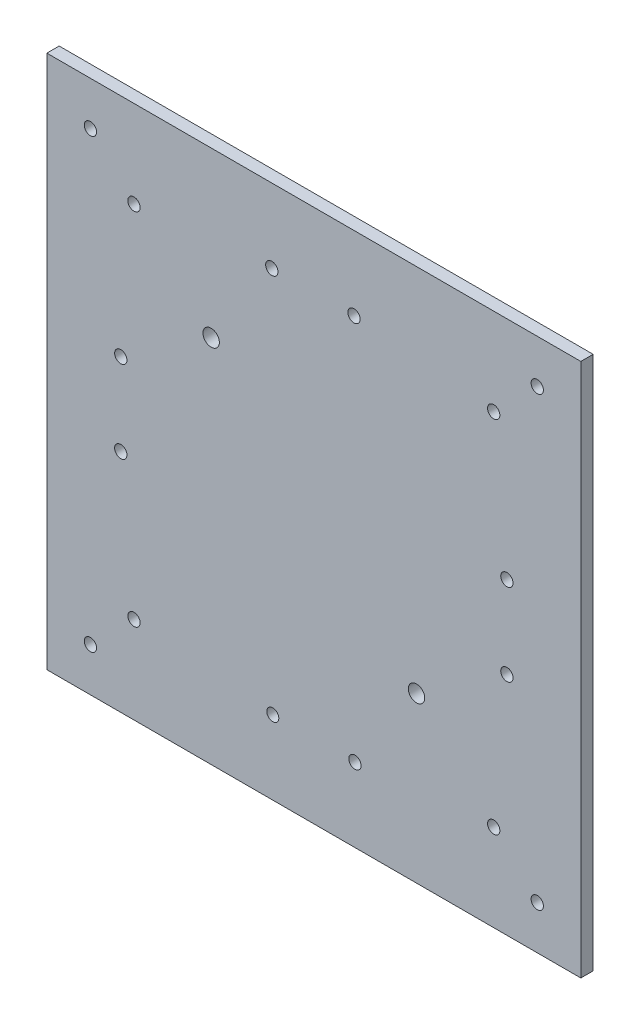
ISO-10303-21;
HEADER;
FILE_DESCRIPTION(('STEP AP214'),'2;1');
FILE_NAME('part.step','',(''),(''),'','','');
FILE_SCHEMA(('AUTOMOTIVE_DESIGN { 1 0 10303 214 1 1 1 1 }'));
ENDSEC;
DATA;
#1=APPLICATION_CONTEXT('core data for automotive mechanical design processes');
#2=APPLICATION_PROTOCOL_DEFINITION('international standard','automotive_design',2000,#1);
#3=PRODUCT_CONTEXT('',#1,'mechanical');
#4=PRODUCT('Part','Part','',(#3));
#5=PRODUCT_RELATED_PRODUCT_CATEGORY('part','',(#4));
#6=PRODUCT_DEFINITION_FORMATION('','',#4);
#7=PRODUCT_DEFINITION_CONTEXT('part definition',#1,'design');
#8=PRODUCT_DEFINITION('design','',#6,#7);
#9=PRODUCT_DEFINITION_SHAPE('','',#8);
#10=(LENGTH_UNIT() NAMED_UNIT(*) SI_UNIT(.MILLI.,.METRE.));
#11=(NAMED_UNIT(*) PLANE_ANGLE_UNIT() SI_UNIT($,.RADIAN.));
#12=(NAMED_UNIT(*) SI_UNIT($,.STERADIAN.) SOLID_ANGLE_UNIT());
#13=UNCERTAINTY_MEASURE_WITH_UNIT(LENGTH_MEASURE(1.E-05),#10,'distance_accuracy_value','');
#14=(GEOMETRIC_REPRESENTATION_CONTEXT(3) GLOBAL_UNCERTAINTY_ASSIGNED_CONTEXT((#13)) GLOBAL_UNIT_ASSIGNED_CONTEXT((#10,
#11,#12)) REPRESENTATION_CONTEXT('',''));
#15=CARTESIAN_POINT('',(0.,0.,0.));
#16=DIRECTION('',(0.,0.,1.));
#17=DIRECTION('',(1.,0.,0.));
#18=AXIS2_PLACEMENT_3D('',#15,#16,#17);
#19=CARTESIAN_POINT('',(-65.,-65.,3.));
#20=DIRECTION('',(1.,0.,0.));
#21=DIRECTION('',(0.,0.,-1.));
#22=AXIS2_PLACEMENT_3D('',#19,#20,#21);
#23=PLANE('',#22);
#24=DIRECTION('',(0.,-1.,0.));
#25=VECTOR('',#24,1.);
#26=CARTESIAN_POINT('',(-65.,-65.,0.));
#27=LINE('',#26,#25);
#28=CARTESIAN_POINT('',(-65.,65.,0.));
#29=VERTEX_POINT('',#28);
#30=CARTESIAN_POINT('',(-65.,-65.,0.));
#31=VERTEX_POINT('',#30);
#32=EDGE_CURVE('E106',#29,#31,#27,.T.);
#33=ORIENTED_EDGE('',*,*,#32,.T.);
#34=DIRECTION('',(0.,0.,-1.));
#35=VECTOR('',#34,1.);
#36=CARTESIAN_POINT('',(-65.,-65.,3.));
#37=LINE('',#36,#35);
#38=CARTESIAN_POINT('',(-65.,-65.,3.));
#39=VERTEX_POINT('',#38);
#40=EDGE_CURVE('E11',#39,#31,#37,.T.);
#41=ORIENTED_EDGE('',*,*,#40,.F.);
#42=DIRECTION('',(0.,-1.,0.));
#43=VECTOR('',#42,1.);
#44=CARTESIAN_POINT('',(-65.,-65.,3.));
#45=LINE('',#44,#43);
#46=CARTESIAN_POINT('',(-65.,65.,3.));
#47=VERTEX_POINT('',#46);
#48=EDGE_CURVE('E93',#47,#39,#45,.T.);
#49=ORIENTED_EDGE('',*,*,#48,.F.);
#50=DIRECTION('',(0.,0.,-1.));
#51=VECTOR('',#50,1.);
#52=CARTESIAN_POINT('',(-65.,65.,3.));
#53=LINE('',#52,#51);
#54=EDGE_CURVE('E102',#47,#29,#53,.T.);
#55=ORIENTED_EDGE('',*,*,#54,.T.);
#56=EDGE_LOOP('',(#33,#41,#49,#55));
#57=FACE_BOUND('',#56,.T.);
#58=ADVANCED_FACE('F40',(#57),#23,.F.);
#59=CARTESIAN_POINT('',(65.,-65.,3.));
#60=DIRECTION('',(0.,1.,0.));
#61=DIRECTION('',(-1.,0.,0.));
#62=AXIS2_PLACEMENT_3D('',#59,#60,#61);
#63=PLANE('',#62);
#64=DIRECTION('',(1.,0.,0.));
#65=VECTOR('',#64,1.);
#66=CARTESIAN_POINT('',(65.,-65.,0.));
#67=LINE('',#66,#65);
#68=CARTESIAN_POINT('',(65.,-65.,0.));
#69=VERTEX_POINT('',#68);
#70=EDGE_CURVE('E97',#31,#69,#67,.T.);
#71=ORIENTED_EDGE('',*,*,#70,.T.);
#72=DIRECTION('',(0.,0.,-1.));
#73=VECTOR('',#72,1.);
#74=CARTESIAN_POINT('',(65.,-65.,3.));
#75=LINE('',#74,#73);
#76=CARTESIAN_POINT('',(65.,-65.,3.));
#77=VERTEX_POINT('',#76);
#78=EDGE_CURVE('E49',#77,#69,#75,.T.);
#79=ORIENTED_EDGE('',*,*,#78,.F.);
#80=DIRECTION('',(1.,0.,0.));
#81=VECTOR('',#80,1.);
#82=CARTESIAN_POINT('',(65.,-65.,3.));
#83=LINE('',#82,#81);
#84=EDGE_CURVE('E88',#39,#77,#83,.T.);
#85=ORIENTED_EDGE('',*,*,#84,.F.);
#86=ORIENTED_EDGE('',*,*,#40,.T.);
#87=EDGE_LOOP('',(#71,#79,#85,#86));
#88=FACE_BOUND('',#87,.T.);
#89=ADVANCED_FACE('F96',(#88),#63,.F.);
#90=CARTESIAN_POINT('',(65.,-65.,3.));
#91=DIRECTION('',(-1.,0.,0.));
#92=DIRECTION('',(0.,0.,1.));
#93=AXIS2_PLACEMENT_3D('',#90,#91,#92);
#94=PLANE('',#93);
#95=DIRECTION('',(0.,1.,0.));
#96=VECTOR('',#95,1.);
#97=CARTESIAN_POINT('',(65.,-65.,0.));
#98=LINE('',#97,#96);
#99=CARTESIAN_POINT('',(65.,65.,0.));
#100=VERTEX_POINT('',#99);
#101=EDGE_CURVE('E75',#69,#100,#98,.T.);
#102=ORIENTED_EDGE('',*,*,#101,.T.);
#103=DIRECTION('',(0.,0.,-1.));
#104=VECTOR('',#103,1.);
#105=CARTESIAN_POINT('',(65.,65.,3.));
#106=LINE('',#105,#104);
#107=CARTESIAN_POINT('',(65.,65.,3.));
#108=VERTEX_POINT('',#107);
#109=EDGE_CURVE('E98',#108,#100,#106,.T.);
#110=ORIENTED_EDGE('',*,*,#109,.F.);
#111=DIRECTION('',(0.,1.,0.));
#112=VECTOR('',#111,1.);
#113=CARTESIAN_POINT('',(65.,-65.,3.));
#114=LINE('',#113,#112);
#115=EDGE_CURVE('E91',#77,#108,#114,.T.);
#116=ORIENTED_EDGE('',*,*,#115,.F.);
#117=ORIENTED_EDGE('',*,*,#78,.T.);
#118=EDGE_LOOP('',(#102,#110,#116,#117));
#119=FACE_BOUND('',#118,.T.);
#120=ADVANCED_FACE('F100',(#119),#94,.F.);
#121=CARTESIAN_POINT('',(65.,65.,3.));
#122=DIRECTION('',(0.,-1.,0.));
#123=DIRECTION('',(0.,0.,-1.));
#124=AXIS2_PLACEMENT_3D('',#121,#122,#123);
#125=PLANE('',#124);
#126=DIRECTION('',(-1.,0.,0.));
#127=VECTOR('',#126,1.);
#128=CARTESIAN_POINT('',(65.,65.,0.));
#129=LINE('',#128,#127);
#130=EDGE_CURVE('E81',#100,#29,#129,.T.);
#131=ORIENTED_EDGE('',*,*,#130,.T.);
#132=ORIENTED_EDGE('',*,*,#54,.F.);
#133=DIRECTION('',(-1.,0.,0.));
#134=VECTOR('',#133,1.);
#135=CARTESIAN_POINT('',(65.,65.,3.));
#136=LINE('',#135,#134);
#137=EDGE_CURVE('E58',#108,#47,#136,.T.);
#138=ORIENTED_EDGE('',*,*,#137,.F.);
#139=ORIENTED_EDGE('',*,*,#109,.T.);
#140=EDGE_LOOP('',(#131,#132,#138,#139));
#141=FACE_BOUND('',#140,.T.);
#142=ADVANCED_FACE('F232',(#141),#125,.F.);
#143=CARTESIAN_POINT('',(0.,0.,3.));
#144=DIRECTION('',(0.,0.,1.));
#145=DIRECTION('',(1.,0.,0.));
#146=AXIS2_PLACEMENT_3D('',#143,#144,#145);
#147=PLANE('',#146);
#148=CARTESIAN_POINT('',(47.,-10.,3.));
#149=DIRECTION('',(0.,0.,1.));
#150=DIRECTION('',(1.,0.,0.));
#151=AXIS2_PLACEMENT_3D('',#148,#149,#150);
#152=CIRCLE('',#151,1.5);
#153=CARTESIAN_POINT('',(48.5,-10.,3.));
#154=VERTEX_POINT('',#153);
#155=EDGE_CURVE('E193',#154,#154,#152,.T.);
#156=ORIENTED_EDGE('',*,*,#155,.F.);
#157=EDGE_LOOP('',(#156));
#158=FACE_BOUND('',#157,.T.);
#159=CARTESIAN_POINT('',(-47.,-10.,3.));
#160=DIRECTION('',(0.,0.,1.));
#161=DIRECTION('',(1.,0.,0.));
#162=AXIS2_PLACEMENT_3D('',#159,#160,#161);
#163=CIRCLE('',#162,1.5);
#164=CARTESIAN_POINT('',(-45.5,-10.,3.));
#165=VERTEX_POINT('',#164);
#166=EDGE_CURVE('E196',#165,#165,#163,.T.);
#167=ORIENTED_EDGE('',*,*,#166,.F.);
#168=EDGE_LOOP('',(#167));
#169=FACE_BOUND('',#168,.T.);
#170=CARTESIAN_POINT('',(-47.,10.,3.));
#171=DIRECTION('',(0.,0.,1.));
#172=DIRECTION('',(1.,0.,0.));
#173=AXIS2_PLACEMENT_3D('',#170,#171,#172);
#174=CIRCLE('',#173,1.49999999999999);
#175=CARTESIAN_POINT('',(-45.5,10.,3.));
#176=VERTEX_POINT('',#175);
#177=EDGE_CURVE('E200',#176,#176,#174,.T.);
#178=ORIENTED_EDGE('',*,*,#177,.F.);
#179=EDGE_LOOP('',(#178));
#180=FACE_BOUND('',#179,.T.);
#181=CARTESIAN_POINT('',(54.3933982822018,54.3933982822018,3.));
#182=DIRECTION('',(0.,0.,1.));
#183=DIRECTION('',(1.,0.,0.));
#184=AXIS2_PLACEMENT_3D('',#181,#182,#183);
#185=CIRCLE('',#184,1.5);
#186=CARTESIAN_POINT('',(55.8933982822018,54.3933982822018,3.));
#187=VERTEX_POINT('',#186);
#188=EDGE_CURVE('E185',#187,#187,#185,.T.);
#189=ORIENTED_EDGE('',*,*,#188,.F.);
#190=EDGE_LOOP('',(#189));
#191=FACE_BOUND('',#190,.T.);
#192=CARTESIAN_POINT('',(43.7867965644036,43.7867965644036,3.));
#193=DIRECTION('',(0.,0.,1.));
#194=DIRECTION('',(1.,0.,0.));
#195=AXIS2_PLACEMENT_3D('',#192,#193,#194);
#196=CIRCLE('',#195,1.5);
#197=CARTESIAN_POINT('',(45.2867965644036,43.7867965644036,3.));
#198=VERTEX_POINT('',#197);
#199=EDGE_CURVE('E181',#198,#198,#196,.T.);
#200=ORIENTED_EDGE('',*,*,#199,.F.);
#201=EDGE_LOOP('',(#200));
#202=FACE_BOUND('',#201,.T.);
#203=CARTESIAN_POINT('',(9.76711261553511,47.,3.));
#204=DIRECTION('',(0.,0.,1.));
#205=DIRECTION('',(1.,0.,0.));
#206=AXIS2_PLACEMENT_3D('',#203,#204,#205);
#207=CIRCLE('',#206,1.5);
#208=CARTESIAN_POINT('',(11.2671126155351,47.,3.));
#209=VERTEX_POINT('',#208);
#210=EDGE_CURVE('E184',#209,#209,#207,.T.);
#211=ORIENTED_EDGE('',*,*,#210,.F.);
#212=EDGE_LOOP('',(#211));
#213=FACE_BOUND('',#212,.T.);
#214=CARTESIAN_POINT('',(-10.2328873844649,47.,3.));
#215=DIRECTION('',(0.,0.,1.));
#216=DIRECTION('',(1.,0.,0.));
#217=AXIS2_PLACEMENT_3D('',#214,#215,#216);
#218=CIRCLE('',#217,1.5);
#219=CARTESIAN_POINT('',(-8.73288738446489,47.,3.));
#220=VERTEX_POINT('',#219);
#221=EDGE_CURVE('E188',#220,#220,#218,.T.);
#222=ORIENTED_EDGE('',*,*,#221,.F.);
#223=EDGE_LOOP('',(#222));
#224=FACE_BOUND('',#223,.T.);
#225=CARTESIAN_POINT('',(-43.7867965644036,43.7867965644035,3.));
#226=DIRECTION('',(0.,0.,1.));
#227=DIRECTION('',(1.,0.,0.));
#228=AXIS2_PLACEMENT_3D('',#225,#226,#227);
#229=CIRCLE('',#228,1.5);
#230=CARTESIAN_POINT('',(-42.2867965644036,43.7867965644035,3.));
#231=VERTEX_POINT('',#230);
#232=EDGE_CURVE('E180',#231,#231,#229,.T.);
#233=ORIENTED_EDGE('',*,*,#232,.F.);
#234=EDGE_LOOP('',(#233));
#235=FACE_BOUND('',#234,.T.);
#236=CARTESIAN_POINT('',(54.3933982822017,-54.3933982822018,3.));
#237=DIRECTION('',(0.,0.,1.));
#238=DIRECTION('',(1.,0.,0.));
#239=AXIS2_PLACEMENT_3D('',#236,#237,#238);
#240=CIRCLE('',#239,1.5);
#241=CARTESIAN_POINT('',(55.8933982822017,-54.3933982822018,3.));
#242=VERTEX_POINT('',#241);
#243=EDGE_CURVE('E217',#242,#242,#240,.T.);
#244=ORIENTED_EDGE('',*,*,#243,.F.);
#245=EDGE_LOOP('',(#244));
#246=FACE_BOUND('',#245,.T.);
#247=CARTESIAN_POINT('',(43.7867965644035,-43.7867965644036,3.));
#248=DIRECTION('',(0.,0.,1.));
#249=DIRECTION('',(1.,0.,0.));
#250=AXIS2_PLACEMENT_3D('',#247,#248,#249);
#251=CIRCLE('',#250,1.5);
#252=CARTESIAN_POINT('',(45.2867965644035,-43.7867965644036,3.));
#253=VERTEX_POINT('',#252);
#254=EDGE_CURVE('E220',#253,#253,#251,.T.);
#255=ORIENTED_EDGE('',*,*,#254,.F.);
#256=EDGE_LOOP('',(#255));
#257=FACE_BOUND('',#256,.T.);
#258=CARTESIAN_POINT('',(9.99999999999999,-47.,3.));
#259=DIRECTION('',(0.,0.,1.));
#260=DIRECTION('',(1.,0.,0.));
#261=AXIS2_PLACEMENT_3D('',#258,#259,#260);
#262=CIRCLE('',#261,1.5);
#263=CARTESIAN_POINT('',(11.5,-47.,3.));
#264=VERTEX_POINT('',#263);
#265=EDGE_CURVE('E214',#264,#264,#262,.T.);
#266=ORIENTED_EDGE('',*,*,#265,.F.);
#267=EDGE_LOOP('',(#266));
#268=FACE_BOUND('',#267,.T.);
#269=CARTESIAN_POINT('',(47.,10.,3.));
#270=DIRECTION('',(0.,0.,1.));
#271=DIRECTION('',(1.,0.,0.));
#272=AXIS2_PLACEMENT_3D('',#269,#270,#271);
#273=CIRCLE('',#272,1.5);
#274=CARTESIAN_POINT('',(48.5,10.,3.));
#275=VERTEX_POINT('',#274);
#276=EDGE_CURVE('E197',#275,#275,#273,.T.);
#277=ORIENTED_EDGE('',*,*,#276,.F.);
#278=EDGE_LOOP('',(#277));
#279=FACE_BOUND('',#278,.T.);
#280=CARTESIAN_POINT('',(-54.3933982822018,-54.3933982822018,3.));
#281=DIRECTION('',(0.,0.,1.));
#282=DIRECTION('',(1.,0.,0.));
#283=AXIS2_PLACEMENT_3D('',#280,#281,#282);
#284=CIRCLE('',#283,1.49999999999999);
#285=CARTESIAN_POINT('',(-52.8933982822018,-54.3933982822018,3.));
#286=VERTEX_POINT('',#285);
#287=EDGE_CURVE('E205',#286,#286,#284,.T.);
#288=ORIENTED_EDGE('',*,*,#287,.F.);
#289=EDGE_LOOP('',(#288));
#290=FACE_BOUND('',#289,.T.);
#291=CARTESIAN_POINT('',(-43.7867965644036,-43.7867965644036,3.));
#292=DIRECTION('',(0.,0.,1.));
#293=DIRECTION('',(1.,0.,0.));
#294=AXIS2_PLACEMENT_3D('',#291,#292,#293);
#295=CIRCLE('',#294,1.5);
#296=CARTESIAN_POINT('',(-42.2867965644036,-43.7867965644036,3.));
#297=VERTEX_POINT('',#296);
#298=EDGE_CURVE('E208',#297,#297,#295,.T.);
#299=ORIENTED_EDGE('',*,*,#298,.F.);
#300=EDGE_LOOP('',(#299));
#301=FACE_BOUND('',#300,.T.);
#302=CARTESIAN_POINT('',(-10.,-47.,3.));
#303=DIRECTION('',(0.,0.,1.));
#304=DIRECTION('',(1.,0.,0.));
#305=AXIS2_PLACEMENT_3D('',#302,#303,#304);
#306=CIRCLE('',#305,1.4649641744244);
#307=CARTESIAN_POINT('',(-8.53503582557561,-47.,3.));
#308=VERTEX_POINT('',#307);
#309=EDGE_CURVE('E211',#308,#308,#306,.T.);
#310=ORIENTED_EDGE('',*,*,#309,.F.);
#311=EDGE_LOOP('',(#310));
#312=FACE_BOUND('',#311,.T.);
#313=CARTESIAN_POINT('',(-54.3933982822018,54.3933982822018,3.));
#314=DIRECTION('',(0.,0.,1.));
#315=DIRECTION('',(1.,0.,0.));
#316=AXIS2_PLACEMENT_3D('',#313,#314,#315);
#317=CIRCLE('',#316,1.5);
#318=CARTESIAN_POINT('',(-52.8933982822018,54.3933982822018,3.));
#319=VERTEX_POINT('',#318);
#320=EDGE_CURVE('E119',#319,#319,#317,.T.);
#321=ORIENTED_EDGE('',*,*,#320,.F.);
#322=EDGE_LOOP('',(#321));
#323=FACE_BOUND('',#322,.T.);
#324=CARTESIAN_POINT('',(25.,-25.,3.));
#325=DIRECTION('',(0.,0.,1.));
#326=DIRECTION('',(1.,0.,0.));
#327=AXIS2_PLACEMENT_3D('',#324,#325,#326);
#328=CIRCLE('',#327,2.);
#329=CARTESIAN_POINT('',(27.,-25.,3.));
#330=VERTEX_POINT('',#329);
#331=EDGE_CURVE('E171',#330,#330,#328,.T.);
#332=ORIENTED_EDGE('',*,*,#331,.F.);
#333=EDGE_LOOP('',(#332));
#334=FACE_BOUND('',#333,.T.);
#335=CARTESIAN_POINT('',(-25.,25.,3.));
#336=DIRECTION('',(0.,0.,1.));
#337=DIRECTION('',(1.,0.,0.));
#338=AXIS2_PLACEMENT_3D('',#335,#336,#337);
#339=CIRCLE('',#338,2.);
#340=CARTESIAN_POINT('',(-23.,25.,3.));
#341=VERTEX_POINT('',#340);
#342=EDGE_CURVE('E166',#341,#341,#339,.T.);
#343=ORIENTED_EDGE('',*,*,#342,.F.);
#344=EDGE_LOOP('',(#343));
#345=FACE_BOUND('',#344,.T.);
#346=ORIENTED_EDGE('',*,*,#48,.T.);
#347=ORIENTED_EDGE('',*,*,#84,.T.);
#348=ORIENTED_EDGE('',*,*,#115,.T.);
#349=ORIENTED_EDGE('',*,*,#137,.T.);
#350=EDGE_LOOP('',(#346,#347,#348,#349));
#351=FACE_BOUND('',#350,.T.);
#352=ADVANCED_FACE('F89',(#158,#169,#180,#191,#202,#213,#224,#235,#246,#257,#268,#279,#290,#301,
#312,#323,#334,#345,#351),#147,.T.);
#353=CARTESIAN_POINT('',(0.,0.,0.));
#354=DIRECTION('',(0.,0.,1.));
#355=DIRECTION('',(1.,0.,0.));
#356=AXIS2_PLACEMENT_3D('',#353,#354,#355);
#357=PLANE('',#356);
#358=CARTESIAN_POINT('',(47.,-10.,0.));
#359=DIRECTION('',(0.,0.,1.));
#360=DIRECTION('',(1.,0.,0.));
#361=AXIS2_PLACEMENT_3D('',#358,#359,#360);
#362=CIRCLE('',#361,1.5);
#363=CARTESIAN_POINT('',(48.5,-10.,0.));
#364=VERTEX_POINT('',#363);
#365=EDGE_CURVE('E43',#364,#364,#362,.T.);
#366=ORIENTED_EDGE('',*,*,#365,.T.);
#367=EDGE_LOOP('',(#366));
#368=FACE_BOUND('',#367,.T.);
#369=CARTESIAN_POINT('',(-47.,-10.,0.));
#370=DIRECTION('',(0.,0.,1.));
#371=DIRECTION('',(1.,0.,0.));
#372=AXIS2_PLACEMENT_3D('',#369,#370,#371);
#373=CIRCLE('',#372,1.5);
#374=CARTESIAN_POINT('',(-45.5,-10.,0.));
#375=VERTEX_POINT('',#374);
#376=EDGE_CURVE('E157',#375,#375,#373,.T.);
#377=ORIENTED_EDGE('',*,*,#376,.T.);
#378=EDGE_LOOP('',(#377));
#379=FACE_BOUND('',#378,.T.);
#380=CARTESIAN_POINT('',(-47.,10.,0.));
#381=DIRECTION('',(0.,0.,1.));
#382=DIRECTION('',(1.,0.,0.));
#383=AXIS2_PLACEMENT_3D('',#380,#381,#382);
#384=CIRCLE('',#383,1.49999999999999);
#385=CARTESIAN_POINT('',(-45.5,10.,0.));
#386=VERTEX_POINT('',#385);
#387=EDGE_CURVE('E155',#386,#386,#384,.T.);
#388=ORIENTED_EDGE('',*,*,#387,.T.);
#389=EDGE_LOOP('',(#388));
#390=FACE_BOUND('',#389,.T.);
#391=CARTESIAN_POINT('',(54.3933982822018,54.3933982822018,0.));
#392=DIRECTION('',(0.,0.,1.));
#393=DIRECTION('',(1.,0.,0.));
#394=AXIS2_PLACEMENT_3D('',#391,#392,#393);
#395=CIRCLE('',#394,1.5);
#396=CARTESIAN_POINT('',(55.8933982822018,54.3933982822018,0.));
#397=VERTEX_POINT('',#396);
#398=EDGE_CURVE('E152',#397,#397,#395,.T.);
#399=ORIENTED_EDGE('',*,*,#398,.T.);
#400=EDGE_LOOP('',(#399));
#401=FACE_BOUND('',#400,.T.);
#402=CARTESIAN_POINT('',(43.7867965644036,43.7867965644036,0.));
#403=DIRECTION('',(0.,0.,1.));
#404=DIRECTION('',(1.,0.,0.));
#405=AXIS2_PLACEMENT_3D('',#402,#403,#404);
#406=CIRCLE('',#405,1.5);
#407=CARTESIAN_POINT('',(45.2867965644036,43.7867965644036,0.));
#408=VERTEX_POINT('',#407);
#409=EDGE_CURVE('E149',#408,#408,#406,.T.);
#410=ORIENTED_EDGE('',*,*,#409,.T.);
#411=EDGE_LOOP('',(#410));
#412=FACE_BOUND('',#411,.T.);
#413=CARTESIAN_POINT('',(9.76711261553511,47.,0.));
#414=DIRECTION('',(0.,0.,1.));
#415=DIRECTION('',(1.,0.,0.));
#416=AXIS2_PLACEMENT_3D('',#413,#414,#415);
#417=CIRCLE('',#416,1.5);
#418=CARTESIAN_POINT('',(11.2671126155351,47.,0.));
#419=VERTEX_POINT('',#418);
#420=EDGE_CURVE('E146',#419,#419,#417,.T.);
#421=ORIENTED_EDGE('',*,*,#420,.T.);
#422=EDGE_LOOP('',(#421));
#423=FACE_BOUND('',#422,.T.);
#424=CARTESIAN_POINT('',(-10.2328873844649,47.,0.));
#425=DIRECTION('',(0.,0.,1.));
#426=DIRECTION('',(1.,0.,0.));
#427=AXIS2_PLACEMENT_3D('',#424,#425,#426);
#428=CIRCLE('',#427,1.5);
#429=CARTESIAN_POINT('',(-8.73288738446489,47.,0.));
#430=VERTEX_POINT('',#429);
#431=EDGE_CURVE('E143',#430,#430,#428,.T.);
#432=ORIENTED_EDGE('',*,*,#431,.T.);
#433=EDGE_LOOP('',(#432));
#434=FACE_BOUND('',#433,.T.);
#435=CARTESIAN_POINT('',(-43.7867965644036,43.7867965644035,0.));
#436=DIRECTION('',(0.,0.,1.));
#437=DIRECTION('',(1.,0.,0.));
#438=AXIS2_PLACEMENT_3D('',#435,#436,#437);
#439=CIRCLE('',#438,1.5);
#440=CARTESIAN_POINT('',(-42.2867965644036,43.7867965644035,0.));
#441=VERTEX_POINT('',#440);
#442=EDGE_CURVE('E140',#441,#441,#439,.T.);
#443=ORIENTED_EDGE('',*,*,#442,.T.);
#444=EDGE_LOOP('',(#443));
#445=FACE_BOUND('',#444,.T.);
#446=CARTESIAN_POINT('',(54.3933982822017,-54.3933982822018,0.));
#447=DIRECTION('',(0.,0.,1.));
#448=DIRECTION('',(1.,0.,0.));
#449=AXIS2_PLACEMENT_3D('',#446,#447,#448);
#450=CIRCLE('',#449,1.5);
#451=CARTESIAN_POINT('',(55.8933982822017,-54.3933982822018,0.));
#452=VERTEX_POINT('',#451);
#453=EDGE_CURVE('E137',#452,#452,#450,.T.);
#454=ORIENTED_EDGE('',*,*,#453,.T.);
#455=EDGE_LOOP('',(#454));
#456=FACE_BOUND('',#455,.T.);
#457=CARTESIAN_POINT('',(43.7867965644035,-43.7867965644036,0.));
#458=DIRECTION('',(0.,0.,1.));
#459=DIRECTION('',(1.,0.,0.));
#460=AXIS2_PLACEMENT_3D('',#457,#458,#459);
#461=CIRCLE('',#460,1.5);
#462=CARTESIAN_POINT('',(45.2867965644035,-43.7867965644036,0.));
#463=VERTEX_POINT('',#462);
#464=EDGE_CURVE('E134',#463,#463,#461,.T.);
#465=ORIENTED_EDGE('',*,*,#464,.T.);
#466=EDGE_LOOP('',(#465));
#467=FACE_BOUND('',#466,.T.);
#468=CARTESIAN_POINT('',(9.99999999999999,-47.,0.));
#469=DIRECTION('',(0.,0.,1.));
#470=DIRECTION('',(1.,0.,0.));
#471=AXIS2_PLACEMENT_3D('',#468,#469,#470);
#472=CIRCLE('',#471,1.5);
#473=CARTESIAN_POINT('',(11.5,-47.,0.));
#474=VERTEX_POINT('',#473);
#475=EDGE_CURVE('E131',#474,#474,#472,.T.);
#476=ORIENTED_EDGE('',*,*,#475,.T.);
#477=EDGE_LOOP('',(#476));
#478=FACE_BOUND('',#477,.T.);
#479=CARTESIAN_POINT('',(47.,10.,0.));
#480=DIRECTION('',(0.,0.,1.));
#481=DIRECTION('',(1.,0.,0.));
#482=AXIS2_PLACEMENT_3D('',#479,#480,#481);
#483=CIRCLE('',#482,1.5);
#484=CARTESIAN_POINT('',(48.5,10.,0.));
#485=VERTEX_POINT('',#484);
#486=EDGE_CURVE('E128',#485,#485,#483,.T.);
#487=ORIENTED_EDGE('',*,*,#486,.T.);
#488=EDGE_LOOP('',(#487));
#489=FACE_BOUND('',#488,.T.);
#490=CARTESIAN_POINT('',(-54.3933982822018,-54.3933982822018,0.));
#491=DIRECTION('',(0.,0.,1.));
#492=DIRECTION('',(1.,0.,0.));
#493=AXIS2_PLACEMENT_3D('',#490,#491,#492);
#494=CIRCLE('',#493,1.49999999999999);
#495=CARTESIAN_POINT('',(-52.8933982822018,-54.3933982822018,0.));
#496=VERTEX_POINT('',#495);
#497=EDGE_CURVE('E125',#496,#496,#494,.T.);
#498=ORIENTED_EDGE('',*,*,#497,.T.);
#499=EDGE_LOOP('',(#498));
#500=FACE_BOUND('',#499,.T.);
#501=CARTESIAN_POINT('',(-43.7867965644036,-43.7867965644036,0.));
#502=DIRECTION('',(0.,0.,1.));
#503=DIRECTION('',(1.,0.,0.));
#504=AXIS2_PLACEMENT_3D('',#501,#502,#503);
#505=CIRCLE('',#504,1.5);
#506=CARTESIAN_POINT('',(-42.2867965644036,-43.7867965644036,0.));
#507=VERTEX_POINT('',#506);
#508=EDGE_CURVE('E122',#507,#507,#505,.T.);
#509=ORIENTED_EDGE('',*,*,#508,.T.);
#510=EDGE_LOOP('',(#509));
#511=FACE_BOUND('',#510,.T.);
#512=CARTESIAN_POINT('',(-10.,-47.,0.));
#513=DIRECTION('',(0.,0.,1.));
#514=DIRECTION('',(1.,0.,0.));
#515=AXIS2_PLACEMENT_3D('',#512,#513,#514);
#516=CIRCLE('',#515,1.4649641744244);
#517=CARTESIAN_POINT('',(-8.53503582557561,-47.,0.));
#518=VERTEX_POINT('',#517);
#519=EDGE_CURVE('E118',#518,#518,#516,.T.);
#520=ORIENTED_EDGE('',*,*,#519,.T.);
#521=EDGE_LOOP('',(#520));
#522=FACE_BOUND('',#521,.T.);
#523=CARTESIAN_POINT('',(-54.3933982822018,54.3933982822018,0.));
#524=DIRECTION('',(0.,0.,1.));
#525=DIRECTION('',(1.,0.,0.));
#526=AXIS2_PLACEMENT_3D('',#523,#524,#525);
#527=CIRCLE('',#526,1.5);
#528=CARTESIAN_POINT('',(-52.8933982822018,54.3933982822018,0.));
#529=VERTEX_POINT('',#528);
#530=EDGE_CURVE('E115',#529,#529,#527,.T.);
#531=ORIENTED_EDGE('',*,*,#530,.T.);
#532=EDGE_LOOP('',(#531));
#533=FACE_BOUND('',#532,.T.);
#534=CARTESIAN_POINT('',(25.,-25.,0.));
#535=DIRECTION('',(0.,0.,1.));
#536=DIRECTION('',(1.,0.,0.));
#537=AXIS2_PLACEMENT_3D('',#534,#535,#536);
#538=CIRCLE('',#537,2.);
#539=CARTESIAN_POINT('',(27.,-25.,0.));
#540=VERTEX_POINT('',#539);
#541=EDGE_CURVE('E109',#540,#540,#538,.T.);
#542=ORIENTED_EDGE('',*,*,#541,.T.);
#543=EDGE_LOOP('',(#542));
#544=FACE_BOUND('',#543,.T.);
#545=CARTESIAN_POINT('',(-25.,25.,0.));
#546=DIRECTION('',(0.,0.,1.));
#547=DIRECTION('',(1.,0.,0.));
#548=AXIS2_PLACEMENT_3D('',#545,#546,#547);
#549=CIRCLE('',#548,2.);
#550=CARTESIAN_POINT('',(-23.,25.,0.));
#551=VERTEX_POINT('',#550);
#552=EDGE_CURVE('E162',#551,#551,#549,.T.);
#553=ORIENTED_EDGE('',*,*,#552,.T.);
#554=EDGE_LOOP('',(#553));
#555=FACE_BOUND('',#554,.T.);
#556=ORIENTED_EDGE('',*,*,#32,.F.);
#557=ORIENTED_EDGE('',*,*,#130,.F.);
#558=ORIENTED_EDGE('',*,*,#101,.F.);
#559=ORIENTED_EDGE('',*,*,#70,.F.);
#560=EDGE_LOOP('',(#556,#557,#558,#559));
#561=FACE_BOUND('',#560,.T.);
#562=ADVANCED_FACE('F231',(#368,#379,#390,#401,#412,#423,#434,#445,#456,#467,#478,#489,#500,
#511,#522,#533,#544,#555,#561),#357,.F.);
#563=CARTESIAN_POINT('',(-25.,25.,0.));
#564=DIRECTION('',(0.,0.,1.));
#565=DIRECTION('',(1.,0.,0.));
#566=AXIS2_PLACEMENT_3D('',#563,#564,#565);
#567=CYLINDRICAL_SURFACE('',#566,2.);
#568=ORIENTED_EDGE('',*,*,#552,.F.);
#569=EDGE_LOOP('',(#568));
#570=FACE_BOUND('',#569,.T.);
#571=ORIENTED_EDGE('',*,*,#342,.T.);
#572=EDGE_LOOP('',(#571));
#573=FACE_BOUND('',#572,.T.);
#574=ADVANCED_FACE('F249',(#570,#573),#567,.F.);
#575=CARTESIAN_POINT('',(25.,-25.,0.));
#576=DIRECTION('',(0.,0.,1.));
#577=DIRECTION('',(1.,0.,0.));
#578=AXIS2_PLACEMENT_3D('',#575,#576,#577);
#579=CYLINDRICAL_SURFACE('',#578,2.);
#580=ORIENTED_EDGE('',*,*,#541,.F.);
#581=EDGE_LOOP('',(#580));
#582=FACE_BOUND('',#581,.T.);
#583=ORIENTED_EDGE('',*,*,#331,.T.);
#584=EDGE_LOOP('',(#583));
#585=FACE_BOUND('',#584,.T.);
#586=ADVANCED_FACE('F251',(#582,#585),#579,.F.);
#587=CARTESIAN_POINT('',(-54.3933982822018,54.3933982822018,-7.));
#588=DIRECTION('',(0.,0.,1.));
#589=DIRECTION('',(1.,0.,0.));
#590=AXIS2_PLACEMENT_3D('',#587,#588,#589);
#591=CYLINDRICAL_SURFACE('',#590,1.5);
#592=ORIENTED_EDGE('',*,*,#320,.T.);
#593=EDGE_LOOP('',(#592));
#594=FACE_BOUND('',#593,.T.);
#595=ORIENTED_EDGE('',*,*,#530,.F.);
#596=EDGE_LOOP('',(#595));
#597=FACE_BOUND('',#596,.T.);
#598=ADVANCED_FACE('F258',(#594,#597),#591,.F.);
#599=CARTESIAN_POINT('',(-10.,-47.,-7.));
#600=DIRECTION('',(0.,0.,1.));
#601=DIRECTION('',(1.,0.,0.));
#602=AXIS2_PLACEMENT_3D('',#599,#600,#601);
#603=CYLINDRICAL_SURFACE('',#602,1.4649641744244);
#604=ORIENTED_EDGE('',*,*,#309,.T.);
#605=EDGE_LOOP('',(#604));
#606=FACE_BOUND('',#605,.T.);
#607=ORIENTED_EDGE('',*,*,#519,.F.);
#608=EDGE_LOOP('',(#607));
#609=FACE_BOUND('',#608,.T.);
#610=ADVANCED_FACE('F330',(#606,#609),#603,.F.);
#611=CARTESIAN_POINT('',(-43.7867965644036,-43.7867965644036,-7.));
#612=DIRECTION('',(0.,0.,1.));
#613=DIRECTION('',(1.,0.,0.));
#614=AXIS2_PLACEMENT_3D('',#611,#612,#613);
#615=CYLINDRICAL_SURFACE('',#614,1.5);
#616=ORIENTED_EDGE('',*,*,#298,.T.);
#617=EDGE_LOOP('',(#616));
#618=FACE_BOUND('',#617,.T.);
#619=ORIENTED_EDGE('',*,*,#508,.F.);
#620=EDGE_LOOP('',(#619));
#621=FACE_BOUND('',#620,.T.);
#622=ADVANCED_FACE('F340',(#618,#621),#615,.F.);
#623=CARTESIAN_POINT('',(-54.3933982822018,-54.3933982822018,-7.));
#624=DIRECTION('',(0.,0.,1.));
#625=DIRECTION('',(1.,0.,0.));
#626=AXIS2_PLACEMENT_3D('',#623,#624,#625);
#627=CYLINDRICAL_SURFACE('',#626,1.49999999999999);
#628=ORIENTED_EDGE('',*,*,#287,.T.);
#629=EDGE_LOOP('',(#628));
#630=FACE_BOUND('',#629,.T.);
#631=ORIENTED_EDGE('',*,*,#497,.F.);
#632=EDGE_LOOP('',(#631));
#633=FACE_BOUND('',#632,.T.);
#634=ADVANCED_FACE('F350',(#630,#633),#627,.F.);
#635=CARTESIAN_POINT('',(47.,10.,-7.));
#636=DIRECTION('',(0.,0.,1.));
#637=DIRECTION('',(1.,0.,0.));
#638=AXIS2_PLACEMENT_3D('',#635,#636,#637);
#639=CYLINDRICAL_SURFACE('',#638,1.5);
#640=ORIENTED_EDGE('',*,*,#276,.T.);
#641=EDGE_LOOP('',(#640));
#642=FACE_BOUND('',#641,.T.);
#643=ORIENTED_EDGE('',*,*,#486,.F.);
#644=EDGE_LOOP('',(#643));
#645=FACE_BOUND('',#644,.T.);
#646=ADVANCED_FACE('F360',(#642,#645),#639,.F.);
#647=CARTESIAN_POINT('',(9.99999999999999,-47.,-7.));
#648=DIRECTION('',(0.,0.,1.));
#649=DIRECTION('',(1.,0.,0.));
#650=AXIS2_PLACEMENT_3D('',#647,#648,#649);
#651=CYLINDRICAL_SURFACE('',#650,1.5);
#652=ORIENTED_EDGE('',*,*,#265,.T.);
#653=EDGE_LOOP('',(#652));
#654=FACE_BOUND('',#653,.T.);
#655=ORIENTED_EDGE('',*,*,#475,.F.);
#656=EDGE_LOOP('',(#655));
#657=FACE_BOUND('',#656,.T.);
#658=ADVANCED_FACE('F226',(#654,#657),#651,.F.);
#659=CARTESIAN_POINT('',(43.7867965644035,-43.7867965644036,-7.));
#660=DIRECTION('',(0.,0.,1.));
#661=DIRECTION('',(1.,0.,0.));
#662=AXIS2_PLACEMENT_3D('',#659,#660,#661);
#663=CYLINDRICAL_SURFACE('',#662,1.5);
#664=ORIENTED_EDGE('',*,*,#254,.T.);
#665=EDGE_LOOP('',(#664));
#666=FACE_BOUND('',#665,.T.);
#667=ORIENTED_EDGE('',*,*,#464,.F.);
#668=EDGE_LOOP('',(#667));
#669=FACE_BOUND('',#668,.T.);
#670=ADVANCED_FACE('F379',(#666,#669),#663,.F.);
#671=CARTESIAN_POINT('',(54.3933982822017,-54.3933982822018,-7.));
#672=DIRECTION('',(0.,0.,1.));
#673=DIRECTION('',(1.,0.,0.));
#674=AXIS2_PLACEMENT_3D('',#671,#672,#673);
#675=CYLINDRICAL_SURFACE('',#674,1.5);
#676=ORIENTED_EDGE('',*,*,#243,.T.);
#677=EDGE_LOOP('',(#676));
#678=FACE_BOUND('',#677,.T.);
#679=ORIENTED_EDGE('',*,*,#453,.F.);
#680=EDGE_LOOP('',(#679));
#681=FACE_BOUND('',#680,.T.);
#682=ADVANCED_FACE('F388',(#678,#681),#675,.F.);
#683=CARTESIAN_POINT('',(-43.7867965644036,43.7867965644035,-7.));
#684=DIRECTION('',(0.,0.,1.));
#685=DIRECTION('',(1.,0.,0.));
#686=AXIS2_PLACEMENT_3D('',#683,#684,#685);
#687=CYLINDRICAL_SURFACE('',#686,1.5);
#688=ORIENTED_EDGE('',*,*,#232,.T.);
#689=EDGE_LOOP('',(#688));
#690=FACE_BOUND('',#689,.T.);
#691=ORIENTED_EDGE('',*,*,#442,.F.);
#692=EDGE_LOOP('',(#691));
#693=FACE_BOUND('',#692,.T.);
#694=ADVANCED_FACE('F398',(#690,#693),#687,.F.);
#695=CARTESIAN_POINT('',(-10.2328873844649,47.,-7.));
#696=DIRECTION('',(0.,0.,1.));
#697=DIRECTION('',(1.,0.,0.));
#698=AXIS2_PLACEMENT_3D('',#695,#696,#697);
#699=CYLINDRICAL_SURFACE('',#698,1.5);
#700=ORIENTED_EDGE('',*,*,#221,.T.);
#701=EDGE_LOOP('',(#700));
#702=FACE_BOUND('',#701,.T.);
#703=ORIENTED_EDGE('',*,*,#431,.F.);
#704=EDGE_LOOP('',(#703));
#705=FACE_BOUND('',#704,.T.);
#706=ADVANCED_FACE('F408',(#702,#705),#699,.F.);
#707=CARTESIAN_POINT('',(9.76711261553511,47.,-7.));
#708=DIRECTION('',(0.,0.,1.));
#709=DIRECTION('',(1.,0.,0.));
#710=AXIS2_PLACEMENT_3D('',#707,#708,#709);
#711=CYLINDRICAL_SURFACE('',#710,1.5);
#712=ORIENTED_EDGE('',*,*,#210,.T.);
#713=EDGE_LOOP('',(#712));
#714=FACE_BOUND('',#713,.T.);
#715=ORIENTED_EDGE('',*,*,#420,.F.);
#716=EDGE_LOOP('',(#715));
#717=FACE_BOUND('',#716,.T.);
#718=ADVANCED_FACE('F418',(#714,#717),#711,.F.);
#719=CARTESIAN_POINT('',(43.7867965644036,43.7867965644036,-7.));
#720=DIRECTION('',(0.,0.,1.));
#721=DIRECTION('',(1.,0.,0.));
#722=AXIS2_PLACEMENT_3D('',#719,#720,#721);
#723=CYLINDRICAL_SURFACE('',#722,1.5);
#724=ORIENTED_EDGE('',*,*,#199,.T.);
#725=EDGE_LOOP('',(#724));
#726=FACE_BOUND('',#725,.T.);
#727=ORIENTED_EDGE('',*,*,#409,.F.);
#728=EDGE_LOOP('',(#727));
#729=FACE_BOUND('',#728,.T.);
#730=ADVANCED_FACE('F428',(#726,#729),#723,.F.);
#731=CARTESIAN_POINT('',(54.3933982822018,54.3933982822018,-7.));
#732=DIRECTION('',(0.,0.,1.));
#733=DIRECTION('',(1.,0.,0.));
#734=AXIS2_PLACEMENT_3D('',#731,#732,#733);
#735=CYLINDRICAL_SURFACE('',#734,1.5);
#736=ORIENTED_EDGE('',*,*,#188,.T.);
#737=EDGE_LOOP('',(#736));
#738=FACE_BOUND('',#737,.T.);
#739=ORIENTED_EDGE('',*,*,#398,.F.);
#740=EDGE_LOOP('',(#739));
#741=FACE_BOUND('',#740,.T.);
#742=ADVANCED_FACE('F438',(#738,#741),#735,.F.);
#743=CARTESIAN_POINT('',(-47.,10.,-7.));
#744=DIRECTION('',(0.,0.,1.));
#745=DIRECTION('',(1.,0.,0.));
#746=AXIS2_PLACEMENT_3D('',#743,#744,#745);
#747=CYLINDRICAL_SURFACE('',#746,1.49999999999999);
#748=ORIENTED_EDGE('',*,*,#177,.T.);
#749=EDGE_LOOP('',(#748));
#750=FACE_BOUND('',#749,.T.);
#751=ORIENTED_EDGE('',*,*,#387,.F.);
#752=EDGE_LOOP('',(#751));
#753=FACE_BOUND('',#752,.T.);
#754=ADVANCED_FACE('F448',(#750,#753),#747,.F.);
#755=CARTESIAN_POINT('',(-47.,-10.,-7.));
#756=DIRECTION('',(0.,0.,1.));
#757=DIRECTION('',(1.,0.,0.));
#758=AXIS2_PLACEMENT_3D('',#755,#756,#757);
#759=CYLINDRICAL_SURFACE('',#758,1.5);
#760=ORIENTED_EDGE('',*,*,#166,.T.);
#761=EDGE_LOOP('',(#760));
#762=FACE_BOUND('',#761,.T.);
#763=ORIENTED_EDGE('',*,*,#376,.F.);
#764=EDGE_LOOP('',(#763));
#765=FACE_BOUND('',#764,.T.);
#766=ADVANCED_FACE('F458',(#762,#765),#759,.F.);
#767=CARTESIAN_POINT('',(47.,-10.,-7.));
#768=DIRECTION('',(0.,0.,1.));
#769=DIRECTION('',(1.,0.,0.));
#770=AXIS2_PLACEMENT_3D('',#767,#768,#769);
#771=CYLINDRICAL_SURFACE('',#770,1.5);
#772=ORIENTED_EDGE('',*,*,#155,.T.);
#773=EDGE_LOOP('',(#772));
#774=FACE_BOUND('',#773,.T.);
#775=ORIENTED_EDGE('',*,*,#365,.F.);
#776=EDGE_LOOP('',(#775));
#777=FACE_BOUND('',#776,.T.);
#778=ADVANCED_FACE('F468',(#774,#777),#771,.F.);
#779=CLOSED_SHELL('',(#58,#89,#120,#142,#352,#562,#574,#586,#598,#610,#622,#634,#646,#658,#670,
#682,#694,#706,#718,#730,#742,#754,#766,#778));
#780=MANIFOLD_SOLID_BREP('B2',#779);
#781=ADVANCED_BREP_SHAPE_REPRESENTATION('',(#18,#780),#14);
#782=SHAPE_DEFINITION_REPRESENTATION(#9,#781);
ENDSEC;
END-ISO-10303-21;
